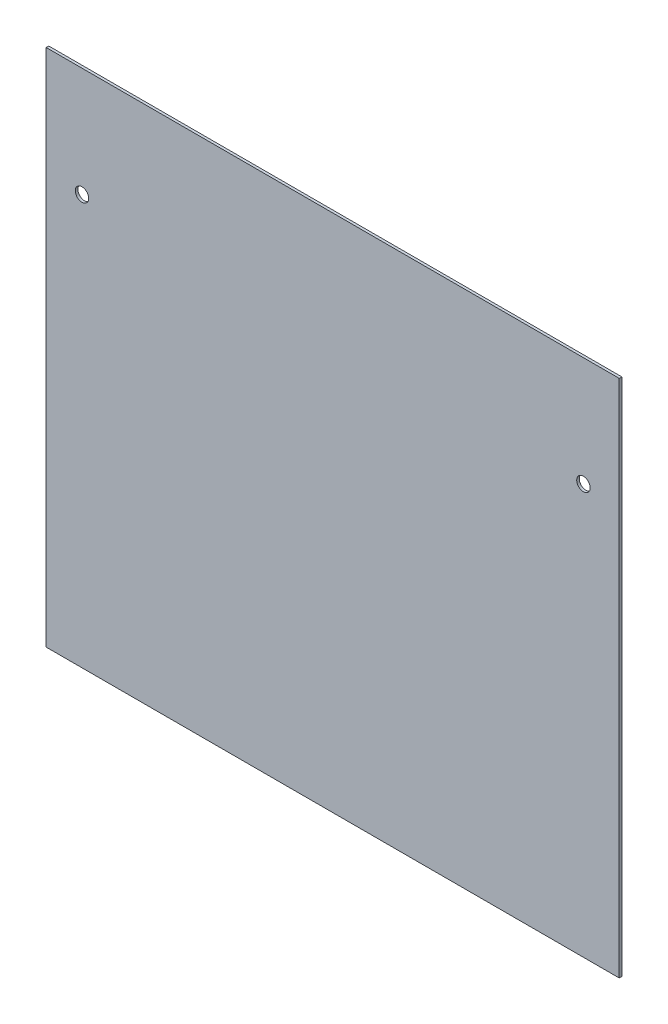
ISO-10303-21;
HEADER;
FILE_DESCRIPTION(('STEP AP214'),'2;1');
FILE_NAME('part.step','',(''),(''),'','','');
FILE_SCHEMA(('AUTOMOTIVE_DESIGN { 1 0 10303 214 1 1 1 1 }'));
ENDSEC;
DATA;
#1=APPLICATION_CONTEXT('core data for automotive mechanical design processes');
#2=APPLICATION_PROTOCOL_DEFINITION('international standard','automotive_design',2000,#1);
#3=PRODUCT_CONTEXT('',#1,'mechanical');
#4=PRODUCT('Part','Part','',(#3));
#5=PRODUCT_RELATED_PRODUCT_CATEGORY('part','',(#4));
#6=PRODUCT_DEFINITION_FORMATION('','',#4);
#7=PRODUCT_DEFINITION_CONTEXT('part definition',#1,'design');
#8=PRODUCT_DEFINITION('design','',#6,#7);
#9=PRODUCT_DEFINITION_SHAPE('','',#8);
#10=(LENGTH_UNIT() NAMED_UNIT(*) SI_UNIT(.MILLI.,.METRE.));
#11=(NAMED_UNIT(*) PLANE_ANGLE_UNIT() SI_UNIT($,.RADIAN.));
#12=(NAMED_UNIT(*) SI_UNIT($,.STERADIAN.) SOLID_ANGLE_UNIT());
#13=UNCERTAINTY_MEASURE_WITH_UNIT(LENGTH_MEASURE(1.E-05),#10,'distance_accuracy_value','');
#14=(GEOMETRIC_REPRESENTATION_CONTEXT(3) GLOBAL_UNCERTAINTY_ASSIGNED_CONTEXT((#13)) GLOBAL_UNIT_ASSIGNED_CONTEXT((#10,
#11,#12)) REPRESENTATION_CONTEXT('',''));
#15=CARTESIAN_POINT('',(0.,0.,0.));
#16=DIRECTION('',(0.,0.,1.));
#17=DIRECTION('',(1.,0.,0.));
#18=AXIS2_PLACEMENT_3D('',#15,#16,#17);
#19=CARTESIAN_POINT('',(144.,130.5,1.2954));
#20=DIRECTION('',(-1.,0.,0.));
#21=DIRECTION('',(0.,-1.,0.));
#22=AXIS2_PLACEMENT_3D('',#19,#20,#21);
#23=PLANE('',#22);
#24=DIRECTION('',(0.,1.,0.));
#25=VECTOR('',#24,1.);
#26=CARTESIAN_POINT('',(144.,130.5,0.));
#27=LINE('',#26,#25);
#28=CARTESIAN_POINT('',(144.,-130.5,0.));
#29=VERTEX_POINT('',#28);
#30=CARTESIAN_POINT('',(144.,130.5,0.));
#31=VERTEX_POINT('',#30);
#32=EDGE_CURVE('E95',#29,#31,#27,.T.);
#33=ORIENTED_EDGE('',*,*,#32,.T.);
#34=DIRECTION('',(0.,0.,-1.));
#35=VECTOR('',#34,1.);
#36=CARTESIAN_POINT('',(144.,130.5,1.2954));
#37=LINE('',#36,#35);
#38=CARTESIAN_POINT('',(144.,130.5,1.2954));
#39=VERTEX_POINT('',#38);
#40=EDGE_CURVE('E11',#39,#31,#37,.T.);
#41=ORIENTED_EDGE('',*,*,#40,.F.);
#42=DIRECTION('',(0.,1.,0.));
#43=VECTOR('',#42,1.);
#44=CARTESIAN_POINT('',(144.,130.5,1.2954));
#45=LINE('',#44,#43);
#46=CARTESIAN_POINT('',(144.,-130.5,1.2954));
#47=VERTEX_POINT('',#46);
#48=EDGE_CURVE('E83',#47,#39,#45,.T.);
#49=ORIENTED_EDGE('',*,*,#48,.F.);
#50=DIRECTION('',(0.,0.,-1.));
#51=VECTOR('',#50,1.);
#52=CARTESIAN_POINT('',(144.,-130.5,1.2954));
#53=LINE('',#52,#51);
#54=EDGE_CURVE('E91',#47,#29,#53,.T.);
#55=ORIENTED_EDGE('',*,*,#54,.T.);
#56=EDGE_LOOP('',(#33,#41,#49,#55));
#57=FACE_BOUND('',#56,.T.);
#58=ADVANCED_FACE('F32',(#57),#23,.F.);
#59=CARTESIAN_POINT('',(-144.,130.5,1.2954));
#60=DIRECTION('',(0.,-1.,0.));
#61=DIRECTION('',(0.,0.,-1.));
#62=AXIS2_PLACEMENT_3D('',#59,#60,#61);
#63=PLANE('',#62);
#64=DIRECTION('',(-1.,0.,0.));
#65=VECTOR('',#64,1.);
#66=CARTESIAN_POINT('',(-144.,130.5,0.));
#67=LINE('',#66,#65);
#68=CARTESIAN_POINT('',(-144.,130.5,0.));
#69=VERTEX_POINT('',#68);
#70=EDGE_CURVE('E87',#31,#69,#67,.T.);
#71=ORIENTED_EDGE('',*,*,#70,.T.);
#72=DIRECTION('',(0.,0.,-1.));
#73=VECTOR('',#72,1.);
#74=CARTESIAN_POINT('',(-144.,130.5,1.2954));
#75=LINE('',#74,#73);
#76=CARTESIAN_POINT('',(-144.,130.5,1.2954));
#77=VERTEX_POINT('',#76);
#78=EDGE_CURVE('E40',#77,#69,#75,.T.);
#79=ORIENTED_EDGE('',*,*,#78,.F.);
#80=DIRECTION('',(-1.,0.,0.));
#81=VECTOR('',#80,1.);
#82=CARTESIAN_POINT('',(-144.,130.5,1.2954));
#83=LINE('',#82,#81);
#84=EDGE_CURVE('E78',#39,#77,#83,.T.);
#85=ORIENTED_EDGE('',*,*,#84,.F.);
#86=ORIENTED_EDGE('',*,*,#40,.T.);
#87=EDGE_LOOP('',(#71,#79,#85,#86));
#88=FACE_BOUND('',#87,.T.);
#89=ADVANCED_FACE('F86',(#88),#63,.F.);
#90=CARTESIAN_POINT('',(-144.,130.5,1.2954));
#91=DIRECTION('',(1.,0.,0.));
#92=DIRECTION('',(0.,1.,0.));
#93=AXIS2_PLACEMENT_3D('',#90,#91,#92);
#94=PLANE('',#93);
#95=DIRECTION('',(0.,-1.,0.));
#96=VECTOR('',#95,1.);
#97=CARTESIAN_POINT('',(-144.,130.5,0.));
#98=LINE('',#97,#96);
#99=CARTESIAN_POINT('',(-144.,-130.5,0.));
#100=VERTEX_POINT('',#99);
#101=EDGE_CURVE('E65',#69,#100,#98,.T.);
#102=ORIENTED_EDGE('',*,*,#101,.T.);
#103=DIRECTION('',(0.,0.,-1.));
#104=VECTOR('',#103,1.);
#105=CARTESIAN_POINT('',(-144.,-130.5,1.2954));
#106=LINE('',#105,#104);
#107=CARTESIAN_POINT('',(-144.,-130.5,1.2954));
#108=VERTEX_POINT('',#107);
#109=EDGE_CURVE('E88',#108,#100,#106,.T.);
#110=ORIENTED_EDGE('',*,*,#109,.F.);
#111=DIRECTION('',(0.,-1.,0.));
#112=VECTOR('',#111,1.);
#113=CARTESIAN_POINT('',(-144.,130.5,1.2954));
#114=LINE('',#113,#112);
#115=EDGE_CURVE('E81',#77,#108,#114,.T.);
#116=ORIENTED_EDGE('',*,*,#115,.F.);
#117=ORIENTED_EDGE('',*,*,#78,.T.);
#118=EDGE_LOOP('',(#102,#110,#116,#117));
#119=FACE_BOUND('',#118,.T.);
#120=ADVANCED_FACE('F89',(#119),#94,.F.);
#121=CARTESIAN_POINT('',(-144.,-130.5,1.2954));
#122=DIRECTION('',(0.,1.,0.));
#123=DIRECTION('',(0.,0.,1.));
#124=AXIS2_PLACEMENT_3D('',#121,#122,#123);
#125=PLANE('',#124);
#126=DIRECTION('',(1.,0.,0.));
#127=VECTOR('',#126,1.);
#128=CARTESIAN_POINT('',(-144.,-130.5,0.));
#129=LINE('',#128,#127);
#130=EDGE_CURVE('E71',#100,#29,#129,.T.);
#131=ORIENTED_EDGE('',*,*,#130,.T.);
#132=ORIENTED_EDGE('',*,*,#54,.F.);
#133=DIRECTION('',(1.,0.,0.));
#134=VECTOR('',#133,1.);
#135=CARTESIAN_POINT('',(-144.,-130.5,1.2954));
#136=LINE('',#135,#134);
#137=EDGE_CURVE('E48',#108,#47,#136,.T.);
#138=ORIENTED_EDGE('',*,*,#137,.F.);
#139=ORIENTED_EDGE('',*,*,#109,.T.);
#140=EDGE_LOOP('',(#131,#132,#138,#139));
#141=FACE_BOUND('',#140,.T.);
#142=ADVANCED_FACE('F103',(#141),#125,.F.);
#143=CARTESIAN_POINT('',(0.,0.,1.2954));
#144=DIRECTION('',(0.,0.,1.));
#145=DIRECTION('',(1.,0.,0.));
#146=AXIS2_PLACEMENT_3D('',#143,#144,#145);
#147=PLANE('',#146);
#148=CARTESIAN_POINT('',(-126.,75.5,1.2954));
#149=DIRECTION('',(0.,0.,1.));
#150=DIRECTION('',(1.,0.,0.));
#151=AXIS2_PLACEMENT_3D('',#148,#149,#150);
#152=CIRCLE('',#151,3.37819999999998);
#153=CARTESIAN_POINT('',(-122.6218,75.5,1.2954));
#154=VERTEX_POINT('',#153);
#155=EDGE_CURVE('E117',#154,#154,#152,.T.);
#156=ORIENTED_EDGE('',*,*,#155,.F.);
#157=EDGE_LOOP('',(#156));
#158=FACE_BOUND('',#157,.T.);
#159=CARTESIAN_POINT('',(126.,75.5,1.2954));
#160=DIRECTION('',(0.,0.,1.));
#161=DIRECTION('',(1.,0.,0.));
#162=AXIS2_PLACEMENT_3D('',#159,#160,#161);
#163=CIRCLE('',#162,3.3782);
#164=CARTESIAN_POINT('',(129.3782,75.5,1.2954));
#165=VERTEX_POINT('',#164);
#166=EDGE_CURVE('E111',#165,#165,#163,.T.);
#167=ORIENTED_EDGE('',*,*,#166,.F.);
#168=EDGE_LOOP('',(#167));
#169=FACE_BOUND('',#168,.T.);
#170=ORIENTED_EDGE('',*,*,#48,.T.);
#171=ORIENTED_EDGE('',*,*,#84,.T.);
#172=ORIENTED_EDGE('',*,*,#115,.T.);
#173=ORIENTED_EDGE('',*,*,#137,.T.);
#174=EDGE_LOOP('',(#170,#171,#172,#173));
#175=FACE_BOUND('',#174,.T.);
#176=ADVANCED_FACE('F79',(#158,#169,#175),#147,.T.);
#177=CARTESIAN_POINT('',(0.,0.,0.));
#178=DIRECTION('',(0.,0.,1.));
#179=DIRECTION('',(1.,0.,0.));
#180=AXIS2_PLACEMENT_3D('',#177,#178,#179);
#181=PLANE('',#180);
#182=CARTESIAN_POINT('',(-126.,75.5,0.));
#183=DIRECTION('',(0.,0.,1.));
#184=DIRECTION('',(1.,0.,0.));
#185=AXIS2_PLACEMENT_3D('',#182,#183,#184);
#186=CIRCLE('',#185,3.3782);
#187=CARTESIAN_POINT('',(-122.6218,75.5,0.));
#188=VERTEX_POINT('',#187);
#189=EDGE_CURVE('E114',#188,#188,#186,.T.);
#190=ORIENTED_EDGE('',*,*,#189,.T.);
#191=EDGE_LOOP('',(#190));
#192=FACE_BOUND('',#191,.T.);
#193=CARTESIAN_POINT('',(126.,75.5,0.));
#194=DIRECTION('',(0.,0.,1.));
#195=DIRECTION('',(1.,0.,0.));
#196=AXIS2_PLACEMENT_3D('',#193,#194,#195);
#197=CIRCLE('',#196,3.3782);
#198=CARTESIAN_POINT('',(129.3782,75.5,0.));
#199=VERTEX_POINT('',#198);
#200=EDGE_CURVE('E98',#199,#199,#197,.T.);
#201=ORIENTED_EDGE('',*,*,#200,.T.);
#202=EDGE_LOOP('',(#201));
#203=FACE_BOUND('',#202,.T.);
#204=ORIENTED_EDGE('',*,*,#32,.F.);
#205=ORIENTED_EDGE('',*,*,#130,.F.);
#206=ORIENTED_EDGE('',*,*,#101,.F.);
#207=ORIENTED_EDGE('',*,*,#70,.F.);
#208=EDGE_LOOP('',(#204,#205,#206,#207));
#209=FACE_BOUND('',#208,.T.);
#210=ADVANCED_FACE('F106',(#192,#203,#209),#181,.F.);
#211=CARTESIAN_POINT('',(126.,75.5,1.2954));
#212=DIRECTION('',(0.,0.,1.));
#213=DIRECTION('',(1.,0.,0.));
#214=AXIS2_PLACEMENT_3D('',#211,#212,#213);
#215=CYLINDRICAL_SURFACE('',#214,3.3782);
#216=ORIENTED_EDGE('',*,*,#200,.F.);
#217=EDGE_LOOP('',(#216));
#218=FACE_BOUND('',#217,.T.);
#219=ORIENTED_EDGE('',*,*,#166,.T.);
#220=EDGE_LOOP('',(#219));
#221=FACE_BOUND('',#220,.T.);
#222=ADVANCED_FACE('F128',(#218,#221),#215,.F.);
#223=CARTESIAN_POINT('',(-126.,75.5,1.2954));
#224=DIRECTION('',(0.,0.,1.));
#225=DIRECTION('',(1.,0.,0.));
#226=AXIS2_PLACEMENT_3D('',#223,#224,#225);
#227=CYLINDRICAL_SURFACE('',#226,3.37819999999999);
#228=ORIENTED_EDGE('',*,*,#189,.F.);
#229=EDGE_LOOP('',(#228));
#230=FACE_BOUND('',#229,.T.);
#231=ORIENTED_EDGE('',*,*,#155,.T.);
#232=EDGE_LOOP('',(#231));
#233=FACE_BOUND('',#232,.T.);
#234=ADVANCED_FACE('F121',(#230,#233),#227,.F.);
#235=CLOSED_SHELL('',(#58,#89,#120,#142,#176,#210,#222,#234));
#236=MANIFOLD_SOLID_BREP('B2',#235);
#237=ADVANCED_BREP_SHAPE_REPRESENTATION('',(#18,#236),#14);
#238=SHAPE_DEFINITION_REPRESENTATION(#9,#237);
ENDSEC;
END-ISO-10303-21;
